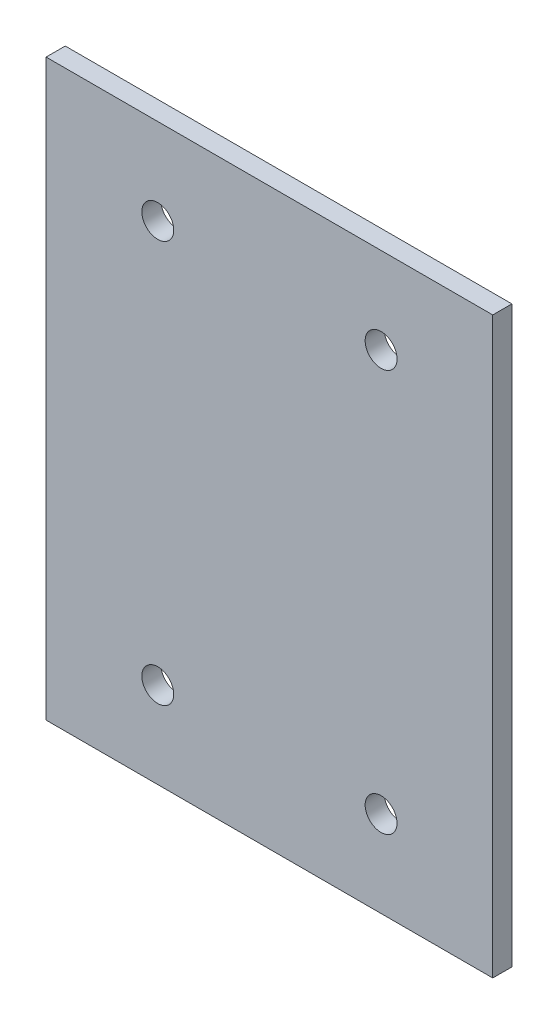
ISO-10303-21;
HEADER;
FILE_DESCRIPTION(('STEP AP214'),'2;1');
FILE_NAME('part.step','',(''),(''),'','','');
FILE_SCHEMA(('AUTOMOTIVE_DESIGN { 1 0 10303 214 1 1 1 1 }'));
ENDSEC;
DATA;
#1=APPLICATION_CONTEXT('core data for automotive mechanical design processes');
#2=APPLICATION_PROTOCOL_DEFINITION('international standard','automotive_design',2000,#1);
#3=PRODUCT_CONTEXT('',#1,'mechanical');
#4=PRODUCT('Part','Part','',(#3));
#5=PRODUCT_RELATED_PRODUCT_CATEGORY('part','',(#4));
#6=PRODUCT_DEFINITION_FORMATION('','',#4);
#7=PRODUCT_DEFINITION_CONTEXT('part definition',#1,'design');
#8=PRODUCT_DEFINITION('design','',#6,#7);
#9=PRODUCT_DEFINITION_SHAPE('','',#8);
#10=(LENGTH_UNIT() NAMED_UNIT(*) SI_UNIT(.MILLI.,.METRE.));
#11=(NAMED_UNIT(*) PLANE_ANGLE_UNIT() SI_UNIT($,.RADIAN.));
#12=(NAMED_UNIT(*) SI_UNIT($,.STERADIAN.) SOLID_ANGLE_UNIT());
#13=UNCERTAINTY_MEASURE_WITH_UNIT(LENGTH_MEASURE(1.E-05),#10,'distance_accuracy_value','');
#14=(GEOMETRIC_REPRESENTATION_CONTEXT(3) GLOBAL_UNCERTAINTY_ASSIGNED_CONTEXT((#13)) GLOBAL_UNIT_ASSIGNED_CONTEXT((#10,
#11,#12)) REPRESENTATION_CONTEXT('',''));
#15=CARTESIAN_POINT('',(0.,0.,0.));
#16=DIRECTION('',(0.,0.,1.));
#17=DIRECTION('',(1.,0.,0.));
#18=AXIS2_PLACEMENT_3D('',#15,#16,#17);
#19=CARTESIAN_POINT('',(-35.,-45.,3.));
#20=DIRECTION('',(1.,0.,0.));
#21=DIRECTION('',(0.,0.,-1.));
#22=AXIS2_PLACEMENT_3D('',#19,#20,#21);
#23=PLANE('',#22);
#24=DIRECTION('',(0.,-1.,0.));
#25=VECTOR('',#24,1.);
#26=CARTESIAN_POINT('',(-35.,-45.,0.));
#27=LINE('',#26,#25);
#28=CARTESIAN_POINT('',(-35.,45.,0.));
#29=VERTEX_POINT('',#28);
#30=CARTESIAN_POINT('',(-35.,-45.,0.));
#31=VERTEX_POINT('',#30);
#32=EDGE_CURVE('E113',#29,#31,#27,.T.);
#33=ORIENTED_EDGE('',*,*,#32,.T.);
#34=DIRECTION('',(0.,0.,-1.));
#35=VECTOR('',#34,1.);
#36=CARTESIAN_POINT('',(-35.,-45.,3.));
#37=LINE('',#36,#35);
#38=CARTESIAN_POINT('',(-35.,-45.,3.));
#39=VERTEX_POINT('',#38);
#40=EDGE_CURVE('E11',#39,#31,#37,.T.);
#41=ORIENTED_EDGE('',*,*,#40,.F.);
#42=DIRECTION('',(0.,-1.,0.));
#43=VECTOR('',#42,1.);
#44=CARTESIAN_POINT('',(-35.,-45.,3.));
#45=LINE('',#44,#43);
#46=CARTESIAN_POINT('',(-35.,45.,3.));
#47=VERTEX_POINT('',#46);
#48=EDGE_CURVE('E97',#47,#39,#45,.T.);
#49=ORIENTED_EDGE('',*,*,#48,.F.);
#50=DIRECTION('',(0.,0.,-1.));
#51=VECTOR('',#50,1.);
#52=CARTESIAN_POINT('',(-35.,45.,3.));
#53=LINE('',#52,#51);
#54=EDGE_CURVE('E109',#47,#29,#53,.T.);
#55=ORIENTED_EDGE('',*,*,#54,.T.);
#56=EDGE_LOOP('',(#33,#41,#49,#55));
#57=FACE_BOUND('',#56,.T.);
#58=ADVANCED_FACE('F45',(#57),#23,.F.);
#59=CARTESIAN_POINT('',(35.,-45.,3.));
#60=DIRECTION('',(0.,1.,0.));
#61=DIRECTION('',(0.,0.,1.));
#62=AXIS2_PLACEMENT_3D('',#59,#60,#61);
#63=PLANE('',#62);
#64=DIRECTION('',(1.,0.,0.));
#65=VECTOR('',#64,1.);
#66=CARTESIAN_POINT('',(35.,-45.,0.));
#67=LINE('',#66,#65);
#68=CARTESIAN_POINT('',(35.,-45.,0.));
#69=VERTEX_POINT('',#68);
#70=EDGE_CURVE('E102',#31,#69,#67,.T.);
#71=ORIENTED_EDGE('',*,*,#70,.T.);
#72=DIRECTION('',(0.,0.,-1.));
#73=VECTOR('',#72,1.);
#74=CARTESIAN_POINT('',(35.,-45.,3.));
#75=LINE('',#74,#73);
#76=CARTESIAN_POINT('',(35.,-45.,3.));
#77=VERTEX_POINT('',#76);
#78=EDGE_CURVE('E54',#77,#69,#75,.T.);
#79=ORIENTED_EDGE('',*,*,#78,.F.);
#80=DIRECTION('',(1.,0.,0.));
#81=VECTOR('',#80,1.);
#82=CARTESIAN_POINT('',(35.,-45.,3.));
#83=LINE('',#82,#81);
#84=EDGE_CURVE('E92',#39,#77,#83,.T.);
#85=ORIENTED_EDGE('',*,*,#84,.F.);
#86=ORIENTED_EDGE('',*,*,#40,.T.);
#87=EDGE_LOOP('',(#71,#79,#85,#86));
#88=FACE_BOUND('',#87,.T.);
#89=ADVANCED_FACE('F101',(#88),#63,.F.);
#90=CARTESIAN_POINT('',(35.,-45.,3.));
#91=DIRECTION('',(-1.,0.,0.));
#92=DIRECTION('',(0.,0.,1.));
#93=AXIS2_PLACEMENT_3D('',#90,#91,#92);
#94=PLANE('',#93);
#95=DIRECTION('',(0.,1.,0.));
#96=VECTOR('',#95,1.);
#97=CARTESIAN_POINT('',(35.,-45.,0.));
#98=LINE('',#97,#96);
#99=CARTESIAN_POINT('',(35.,45.,0.));
#100=VERTEX_POINT('',#99);
#101=EDGE_CURVE('E79',#69,#100,#98,.T.);
#102=ORIENTED_EDGE('',*,*,#101,.T.);
#103=DIRECTION('',(0.,0.,-1.));
#104=VECTOR('',#103,1.);
#105=CARTESIAN_POINT('',(35.,45.,3.));
#106=LINE('',#105,#104);
#107=CARTESIAN_POINT('',(35.,45.,3.));
#108=VERTEX_POINT('',#107);
#109=EDGE_CURVE('E104',#108,#100,#106,.T.);
#110=ORIENTED_EDGE('',*,*,#109,.F.);
#111=DIRECTION('',(0.,1.,0.));
#112=VECTOR('',#111,1.);
#113=CARTESIAN_POINT('',(35.,-45.,3.));
#114=LINE('',#113,#112);
#115=EDGE_CURVE('E95',#77,#108,#114,.T.);
#116=ORIENTED_EDGE('',*,*,#115,.F.);
#117=ORIENTED_EDGE('',*,*,#78,.T.);
#118=EDGE_LOOP('',(#102,#110,#116,#117));
#119=FACE_BOUND('',#118,.T.);
#120=ADVANCED_FACE('F105',(#119),#94,.F.);
#121=CARTESIAN_POINT('',(35.,45.,3.));
#122=DIRECTION('',(0.,-1.,0.));
#123=DIRECTION('',(0.,0.,-1.));
#124=AXIS2_PLACEMENT_3D('',#121,#122,#123);
#125=PLANE('',#124);
#126=DIRECTION('',(-1.,0.,0.));
#127=VECTOR('',#126,1.);
#128=CARTESIAN_POINT('',(35.,45.,0.));
#129=LINE('',#128,#127);
#130=EDGE_CURVE('E85',#100,#29,#129,.T.);
#131=ORIENTED_EDGE('',*,*,#130,.T.);
#132=ORIENTED_EDGE('',*,*,#54,.F.);
#133=DIRECTION('',(-1.,0.,0.));
#134=VECTOR('',#133,1.);
#135=CARTESIAN_POINT('',(35.,45.,3.));
#136=LINE('',#135,#134);
#137=EDGE_CURVE('E62',#108,#47,#136,.T.);
#138=ORIENTED_EDGE('',*,*,#137,.F.);
#139=ORIENTED_EDGE('',*,*,#109,.T.);
#140=EDGE_LOOP('',(#131,#132,#138,#139));
#141=FACE_BOUND('',#140,.T.);
#142=ADVANCED_FACE('F127',(#141),#125,.F.);
#143=CARTESIAN_POINT('',(0.,0.,3.));
#144=DIRECTION('',(0.,0.,1.));
#145=DIRECTION('',(1.,0.,0.));
#146=AXIS2_PLACEMENT_3D('',#143,#144,#145);
#147=PLANE('',#146);
#148=CARTESIAN_POINT('',(-17.5,-31.5,3.));
#149=DIRECTION('',(0.,0.,-1.));
#150=DIRECTION('',(1.,0.,0.));
#151=AXIS2_PLACEMENT_3D('',#148,#149,#150);
#152=CIRCLE('',#151,2.5);
#153=CARTESIAN_POINT('',(-15.,-31.5,3.));
#154=VERTEX_POINT('',#153);
#155=EDGE_CURVE('E158',#154,#154,#152,.T.);
#156=ORIENTED_EDGE('',*,*,#155,.T.);
#157=EDGE_LOOP('',(#156));
#158=FACE_BOUND('',#157,.T.);
#159=CARTESIAN_POINT('',(17.5,-31.5,3.));
#160=DIRECTION('',(0.,0.,-1.));
#161=DIRECTION('',(1.,0.,0.));
#162=AXIS2_PLACEMENT_3D('',#159,#160,#161);
#163=CIRCLE('',#162,2.5);
#164=CARTESIAN_POINT('',(20.,-31.5,3.));
#165=VERTEX_POINT('',#164);
#166=EDGE_CURVE('E150',#165,#165,#163,.T.);
#167=ORIENTED_EDGE('',*,*,#166,.T.);
#168=EDGE_LOOP('',(#167));
#169=FACE_BOUND('',#168,.T.);
#170=CARTESIAN_POINT('',(-17.5,31.5,3.));
#171=DIRECTION('',(0.,0.,1.));
#172=DIRECTION('',(1.,0.,0.));
#173=AXIS2_PLACEMENT_3D('',#170,#171,#172);
#174=CIRCLE('',#173,2.5);
#175=CARTESIAN_POINT('',(-15.,31.5,3.));
#176=VERTEX_POINT('',#175);
#177=EDGE_CURVE('E143',#176,#176,#174,.T.);
#178=ORIENTED_EDGE('',*,*,#177,.F.);
#179=EDGE_LOOP('',(#178));
#180=FACE_BOUND('',#179,.T.);
#181=CARTESIAN_POINT('',(17.5,31.5,3.));
#182=DIRECTION('',(0.,0.,1.));
#183=DIRECTION('',(1.,0.,0.));
#184=AXIS2_PLACEMENT_3D('',#181,#182,#183);
#185=CIRCLE('',#184,2.5);
#186=CARTESIAN_POINT('',(20.,31.5,3.));
#187=VERTEX_POINT('',#186);
#188=EDGE_CURVE('E138',#187,#187,#185,.T.);
#189=ORIENTED_EDGE('',*,*,#188,.F.);
#190=EDGE_LOOP('',(#189));
#191=FACE_BOUND('',#190,.T.);
#192=ORIENTED_EDGE('',*,*,#48,.T.);
#193=ORIENTED_EDGE('',*,*,#84,.T.);
#194=ORIENTED_EDGE('',*,*,#115,.T.);
#195=ORIENTED_EDGE('',*,*,#137,.T.);
#196=EDGE_LOOP('',(#192,#193,#194,#195));
#197=FACE_BOUND('',#196,.T.);
#198=ADVANCED_FACE('F93',(#158,#169,#180,#191,#197),#147,.T.);
#199=CARTESIAN_POINT('',(0.,0.,0.));
#200=DIRECTION('',(0.,0.,1.));
#201=DIRECTION('',(1.,0.,0.));
#202=AXIS2_PLACEMENT_3D('',#199,#200,#201);
#203=PLANE('',#202);
#204=CARTESIAN_POINT('',(-17.5,-31.5,0.));
#205=DIRECTION('',(0.,0.,-1.));
#206=DIRECTION('',(1.,0.,0.));
#207=AXIS2_PLACEMENT_3D('',#204,#205,#206);
#208=CIRCLE('',#207,2.5);
#209=CARTESIAN_POINT('',(-15.,-31.5,0.));
#210=VERTEX_POINT('',#209);
#211=EDGE_CURVE('E139',#210,#210,#208,.T.);
#212=ORIENTED_EDGE('',*,*,#211,.F.);
#213=EDGE_LOOP('',(#212));
#214=FACE_BOUND('',#213,.T.);
#215=CARTESIAN_POINT('',(17.5,-31.5,0.));
#216=DIRECTION('',(0.,0.,-1.));
#217=DIRECTION('',(1.,0.,0.));
#218=AXIS2_PLACEMENT_3D('',#215,#216,#217);
#219=CIRCLE('',#218,2.5);
#220=CARTESIAN_POINT('',(20.,-31.5,0.));
#221=VERTEX_POINT('',#220);
#222=EDGE_CURVE('E154',#221,#221,#219,.T.);
#223=ORIENTED_EDGE('',*,*,#222,.F.);
#224=EDGE_LOOP('',(#223));
#225=FACE_BOUND('',#224,.T.);
#226=CARTESIAN_POINT('',(-17.5,31.5,0.));
#227=DIRECTION('',(0.,0.,1.));
#228=DIRECTION('',(1.,0.,0.));
#229=AXIS2_PLACEMENT_3D('',#226,#227,#228);
#230=CIRCLE('',#229,2.5);
#231=CARTESIAN_POINT('',(-15.,31.5,0.));
#232=VERTEX_POINT('',#231);
#233=EDGE_CURVE('E117',#232,#232,#230,.T.);
#234=ORIENTED_EDGE('',*,*,#233,.T.);
#235=EDGE_LOOP('',(#234));
#236=FACE_BOUND('',#235,.T.);
#237=CARTESIAN_POINT('',(17.5,31.5,0.));
#238=DIRECTION('',(0.,0.,1.));
#239=DIRECTION('',(1.,0.,0.));
#240=AXIS2_PLACEMENT_3D('',#237,#238,#239);
#241=CIRCLE('',#240,2.5);
#242=CARTESIAN_POINT('',(20.,31.5,0.));
#243=VERTEX_POINT('',#242);
#244=EDGE_CURVE('E134',#243,#243,#241,.T.);
#245=ORIENTED_EDGE('',*,*,#244,.T.);
#246=EDGE_LOOP('',(#245));
#247=FACE_BOUND('',#246,.T.);
#248=ORIENTED_EDGE('',*,*,#32,.F.);
#249=ORIENTED_EDGE('',*,*,#130,.F.);
#250=ORIENTED_EDGE('',*,*,#101,.F.);
#251=ORIENTED_EDGE('',*,*,#70,.F.);
#252=EDGE_LOOP('',(#248,#249,#250,#251));
#253=FACE_BOUND('',#252,.T.);
#254=ADVANCED_FACE('F130',(#214,#225,#236,#247,#253),#203,.F.);
#255=CARTESIAN_POINT('',(17.5,31.5,0.));
#256=DIRECTION('',(0.,0.,1.));
#257=DIRECTION('',(1.,0.,0.));
#258=AXIS2_PLACEMENT_3D('',#255,#256,#257);
#259=CYLINDRICAL_SURFACE('',#258,2.5);
#260=ORIENTED_EDGE('',*,*,#244,.F.);
#261=EDGE_LOOP('',(#260));
#262=FACE_BOUND('',#261,.T.);
#263=ORIENTED_EDGE('',*,*,#188,.T.);
#264=EDGE_LOOP('',(#263));
#265=FACE_BOUND('',#264,.T.);
#266=ADVANCED_FACE('F171',(#262,#265),#259,.F.);
#267=CARTESIAN_POINT('',(-17.5,31.5,0.));
#268=DIRECTION('',(0.,0.,1.));
#269=DIRECTION('',(1.,0.,0.));
#270=AXIS2_PLACEMENT_3D('',#267,#268,#269);
#271=CYLINDRICAL_SURFACE('',#270,2.5);
#272=ORIENTED_EDGE('',*,*,#233,.F.);
#273=EDGE_LOOP('',(#272));
#274=FACE_BOUND('',#273,.T.);
#275=ORIENTED_EDGE('',*,*,#177,.T.);
#276=EDGE_LOOP('',(#275));
#277=FACE_BOUND('',#276,.T.);
#278=ADVANCED_FACE('F181',(#274,#277),#271,.F.);
#279=CARTESIAN_POINT('',(17.5,-31.5,0.));
#280=DIRECTION('',(0.,0.,1.));
#281=DIRECTION('',(1.,0.,0.));
#282=AXIS2_PLACEMENT_3D('',#279,#280,#281);
#283=CYLINDRICAL_SURFACE('',#282,2.5);
#284=ORIENTED_EDGE('',*,*,#222,.T.);
#285=EDGE_LOOP('',(#284));
#286=FACE_BOUND('',#285,.T.);
#287=ORIENTED_EDGE('',*,*,#166,.F.);
#288=EDGE_LOOP('',(#287));
#289=FACE_BOUND('',#288,.T.);
#290=ADVANCED_FACE('F220',(#286,#289),#283,.F.);
#291=CARTESIAN_POINT('',(-17.5,-31.5,0.));
#292=DIRECTION('',(0.,0.,1.));
#293=DIRECTION('',(1.,0.,0.));
#294=AXIS2_PLACEMENT_3D('',#291,#292,#293);
#295=CYLINDRICAL_SURFACE('',#294,2.5);
#296=ORIENTED_EDGE('',*,*,#211,.T.);
#297=EDGE_LOOP('',(#296));
#298=FACE_BOUND('',#297,.T.);
#299=ORIENTED_EDGE('',*,*,#155,.F.);
#300=EDGE_LOOP('',(#299));
#301=FACE_BOUND('',#300,.T.);
#302=ADVANCED_FACE('F166',(#298,#301),#295,.F.);
#303=CLOSED_SHELL('',(#58,#89,#120,#142,#198,#254,#266,#278,#290,#302));
#304=MANIFOLD_SOLID_BREP('B2',#303);
#305=ADVANCED_BREP_SHAPE_REPRESENTATION('',(#18,#304),#14);
#306=SHAPE_DEFINITION_REPRESENTATION(#9,#305);
ENDSEC;
END-ISO-10303-21;
